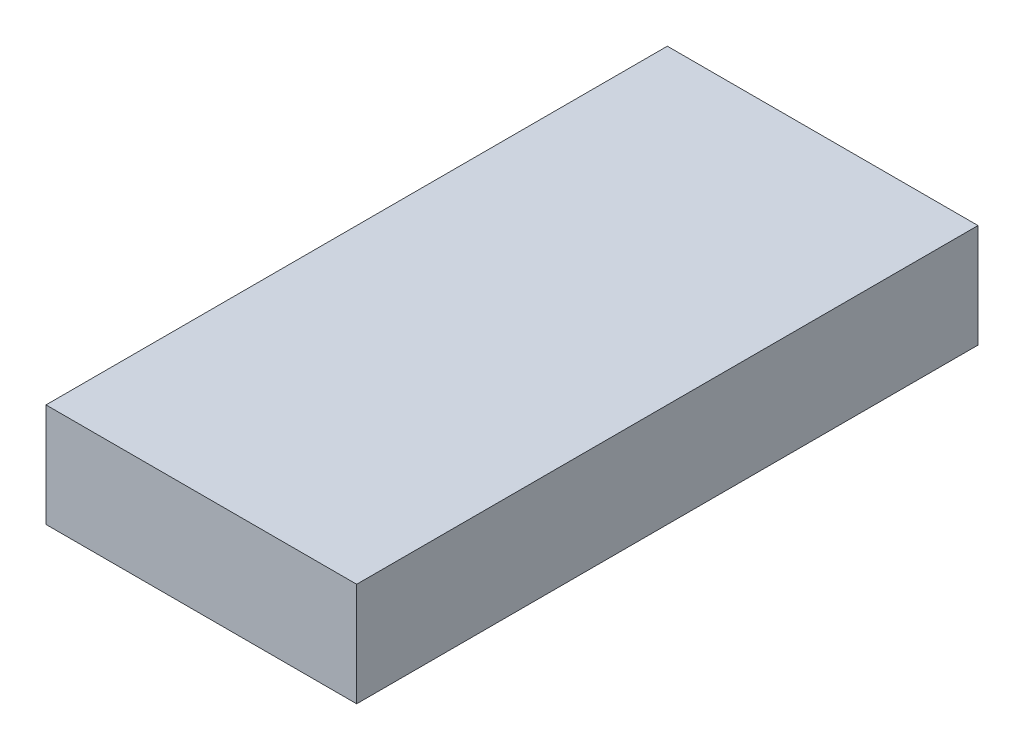
ISO-10303-21;
HEADER;
FILE_DESCRIPTION(('STEP AP214'),'2;1');
FILE_NAME('part.step','',(''),(''),'','','');
FILE_SCHEMA(('AUTOMOTIVE_DESIGN { 1 0 10303 214 1 1 1 1 }'));
ENDSEC;
DATA;
#1=APPLICATION_CONTEXT('core data for automotive mechanical design processes');
#2=APPLICATION_PROTOCOL_DEFINITION('international standard','automotive_design',2000,#1);
#3=PRODUCT_CONTEXT('',#1,'mechanical');
#4=PRODUCT('Part','Part','',(#3));
#5=PRODUCT_RELATED_PRODUCT_CATEGORY('part','',(#4));
#6=PRODUCT_DEFINITION_FORMATION('','',#4);
#7=PRODUCT_DEFINITION_CONTEXT('part definition',#1,'design');
#8=PRODUCT_DEFINITION('design','',#6,#7);
#9=PRODUCT_DEFINITION_SHAPE('','',#8);
#10=(LENGTH_UNIT() NAMED_UNIT(*) SI_UNIT(.MILLI.,.METRE.));
#11=(NAMED_UNIT(*) PLANE_ANGLE_UNIT() SI_UNIT($,.RADIAN.));
#12=(NAMED_UNIT(*) SI_UNIT($,.STERADIAN.) SOLID_ANGLE_UNIT());
#13=UNCERTAINTY_MEASURE_WITH_UNIT(LENGTH_MEASURE(1.E-05),#10,'distance_accuracy_value','');
#14=(GEOMETRIC_REPRESENTATION_CONTEXT(3) GLOBAL_UNCERTAINTY_ASSIGNED_CONTEXT((#13)) GLOBAL_UNIT_ASSIGNED_CONTEXT((#10,
#11,#12)) REPRESENTATION_CONTEXT('',''));
#15=CARTESIAN_POINT('',(0.,0.,0.));
#16=DIRECTION('',(0.,0.,1.));
#17=DIRECTION('',(1.,0.,0.));
#18=AXIS2_PLACEMENT_3D('',#15,#16,#17);
#19=CARTESIAN_POINT('',(15.,10.,30.));
#20=DIRECTION('',(-1.,0.,0.));
#21=DIRECTION('',(0.,0.,1.));
#22=AXIS2_PLACEMENT_3D('',#19,#20,#21);
#23=PLANE('',#22);
#24=DIRECTION('',(0.,0.,-1.));
#25=VECTOR('',#24,1.);
#26=CARTESIAN_POINT('',(15.,0.,30.));
#27=LINE('',#26,#25);
#28=CARTESIAN_POINT('',(15.,0.,30.));
#29=VERTEX_POINT('',#28);
#30=CARTESIAN_POINT('',(15.,0.,-30.));
#31=VERTEX_POINT('',#30);
#32=EDGE_CURVE('E113',#29,#31,#27,.T.);
#33=ORIENTED_EDGE('',*,*,#32,.T.);
#34=DIRECTION('',(0.,-1.,0.));
#35=VECTOR('',#34,1.);
#36=CARTESIAN_POINT('',(15.,10.,-30.));
#37=LINE('',#36,#35);
#38=CARTESIAN_POINT('',(15.,10.,-30.));
#39=VERTEX_POINT('',#38);
#40=EDGE_CURVE('E11',#39,#31,#37,.T.);
#41=ORIENTED_EDGE('',*,*,#40,.F.);
#42=DIRECTION('',(0.,0.,-1.));
#43=VECTOR('',#42,1.);
#44=CARTESIAN_POINT('',(15.,10.,30.));
#45=LINE('',#44,#43);
#46=CARTESIAN_POINT('',(15.,10.,30.));
#47=VERTEX_POINT('',#46);
#48=EDGE_CURVE('E97',#47,#39,#45,.T.);
#49=ORIENTED_EDGE('',*,*,#48,.F.);
#50=DIRECTION('',(0.,-1.,0.));
#51=VECTOR('',#50,1.);
#52=CARTESIAN_POINT('',(15.,10.,30.));
#53=LINE('',#52,#51);
#54=EDGE_CURVE('E109',#47,#29,#53,.T.);
#55=ORIENTED_EDGE('',*,*,#54,.T.);
#56=EDGE_LOOP('',(#33,#41,#49,#55));
#57=FACE_BOUND('',#56,.T.);
#58=ADVANCED_FACE('F45',(#57),#23,.F.);
#59=CARTESIAN_POINT('',(-15.,10.,-30.));
#60=DIRECTION('',(0.,0.,1.));
#61=DIRECTION('',(1.,0.,0.));
#62=AXIS2_PLACEMENT_3D('',#59,#60,#61);
#63=PLANE('',#62);
#64=CARTESIAN_POINT('',(7.49999999999999,5.,-30.));
#65=DIRECTION('',(0.,0.,-1.));
#66=DIRECTION('',(-1.,0.,0.));
#67=AXIS2_PLACEMENT_3D('',#64,#65,#66);
#68=CIRCLE('',#67,2.);
#69=CARTESIAN_POINT('',(5.49999999999999,5.,-30.));
#70=VERTEX_POINT('',#69);
#71=EDGE_CURVE('E142',#70,#70,#68,.T.);
#72=ORIENTED_EDGE('',*,*,#71,.F.);
#73=EDGE_LOOP('',(#72));
#74=FACE_BOUND('',#73,.T.);
#75=CARTESIAN_POINT('',(-7.50000000000004,5.00000000000005,-30.));
#76=DIRECTION('',(0.,0.,-1.));
#77=DIRECTION('',(1.,0.,0.));
#78=AXIS2_PLACEMENT_3D('',#75,#76,#77);
#79=CIRCLE('',#78,2.);
#80=CARTESIAN_POINT('',(-5.50000000000004,5.00000000000005,-30.));
#81=VERTEX_POINT('',#80);
#82=EDGE_CURVE('E138',#81,#81,#79,.T.);
#83=ORIENTED_EDGE('',*,*,#82,.F.);
#84=EDGE_LOOP('',(#83));
#85=FACE_BOUND('',#84,.T.);
#86=DIRECTION('',(-1.,0.,0.));
#87=VECTOR('',#86,1.);
#88=CARTESIAN_POINT('',(-15.,0.,-30.));
#89=LINE('',#88,#87);
#90=CARTESIAN_POINT('',(-15.,0.,-30.));
#91=VERTEX_POINT('',#90);
#92=EDGE_CURVE('E102',#31,#91,#89,.T.);
#93=ORIENTED_EDGE('',*,*,#92,.T.);
#94=DIRECTION('',(0.,-1.,0.));
#95=VECTOR('',#94,1.);
#96=CARTESIAN_POINT('',(-15.,10.,-30.));
#97=LINE('',#96,#95);
#98=CARTESIAN_POINT('',(-15.,10.,-30.));
#99=VERTEX_POINT('',#98);
#100=EDGE_CURVE('E54',#99,#91,#97,.T.);
#101=ORIENTED_EDGE('',*,*,#100,.F.);
#102=DIRECTION('',(-1.,0.,0.));
#103=VECTOR('',#102,1.);
#104=CARTESIAN_POINT('',(-15.,10.,-30.));
#105=LINE('',#104,#103);
#106=EDGE_CURVE('E92',#39,#99,#105,.T.);
#107=ORIENTED_EDGE('',*,*,#106,.F.);
#108=ORIENTED_EDGE('',*,*,#40,.T.);
#109=EDGE_LOOP('',(#93,#101,#107,#108));
#110=FACE_BOUND('',#109,.T.);
#111=ADVANCED_FACE('F101',(#74,#85,#110),#63,.F.);
#112=CARTESIAN_POINT('',(-15.,10.,30.));
#113=DIRECTION('',(1.,0.,0.));
#114=DIRECTION('',(0.,0.,-1.));
#115=AXIS2_PLACEMENT_3D('',#112,#113,#114);
#116=PLANE('',#115);
#117=DIRECTION('',(0.,0.,1.));
#118=VECTOR('',#117,1.);
#119=CARTESIAN_POINT('',(-15.,0.,30.));
#120=LINE('',#119,#118);
#121=CARTESIAN_POINT('',(-15.,0.,30.));
#122=VERTEX_POINT('',#121);
#123=EDGE_CURVE('E79',#91,#122,#120,.T.);
#124=ORIENTED_EDGE('',*,*,#123,.T.);
#125=DIRECTION('',(0.,-1.,0.));
#126=VECTOR('',#125,1.);
#127=CARTESIAN_POINT('',(-15.,10.,30.));
#128=LINE('',#127,#126);
#129=CARTESIAN_POINT('',(-15.,10.,30.));
#130=VERTEX_POINT('',#129);
#131=EDGE_CURVE('E104',#130,#122,#128,.T.);
#132=ORIENTED_EDGE('',*,*,#131,.F.);
#133=DIRECTION('',(0.,0.,1.));
#134=VECTOR('',#133,1.);
#135=CARTESIAN_POINT('',(-15.,10.,30.));
#136=LINE('',#135,#134);
#137=EDGE_CURVE('E95',#99,#130,#136,.T.);
#138=ORIENTED_EDGE('',*,*,#137,.F.);
#139=ORIENTED_EDGE('',*,*,#100,.T.);
#140=EDGE_LOOP('',(#124,#132,#138,#139));
#141=FACE_BOUND('',#140,.T.);
#142=ADVANCED_FACE('F105',(#141),#116,.F.);
#143=CARTESIAN_POINT('',(-15.,10.,30.));
#144=DIRECTION('',(0.,0.,-1.));
#145=DIRECTION('',(-1.,0.,0.));
#146=AXIS2_PLACEMENT_3D('',#143,#144,#145);
#147=PLANE('',#146);
#148=DIRECTION('',(1.,0.,0.));
#149=VECTOR('',#148,1.);
#150=CARTESIAN_POINT('',(-15.,0.,30.));
#151=LINE('',#150,#149);
#152=EDGE_CURVE('E85',#122,#29,#151,.T.);
#153=ORIENTED_EDGE('',*,*,#152,.T.);
#154=ORIENTED_EDGE('',*,*,#54,.F.);
#155=DIRECTION('',(1.,0.,0.));
#156=VECTOR('',#155,1.);
#157=CARTESIAN_POINT('',(-15.,10.,30.));
#158=LINE('',#157,#156);
#159=EDGE_CURVE('E62',#130,#47,#158,.T.);
#160=ORIENTED_EDGE('',*,*,#159,.F.);
#161=ORIENTED_EDGE('',*,*,#131,.T.);
#162=EDGE_LOOP('',(#153,#154,#160,#161));
#163=FACE_BOUND('',#162,.T.);
#164=ADVANCED_FACE('F127',(#163),#147,.F.);
#165=CARTESIAN_POINT('',(0.,10.,0.));
#166=DIRECTION('',(0.,-1.,0.));
#167=DIRECTION('',(0.,0.,-1.));
#168=AXIS2_PLACEMENT_3D('',#165,#166,#167);
#169=PLANE('',#168);
#170=ORIENTED_EDGE('',*,*,#48,.T.);
#171=ORIENTED_EDGE('',*,*,#106,.T.);
#172=ORIENTED_EDGE('',*,*,#137,.T.);
#173=ORIENTED_EDGE('',*,*,#159,.T.);
#174=EDGE_LOOP('',(#170,#171,#172,#173));
#175=FACE_BOUND('',#174,.T.);
#176=ADVANCED_FACE('F93',(#175),#169,.F.);
#177=CARTESIAN_POINT('',(0.,0.,0.));
#178=DIRECTION('',(0.,-1.,0.));
#179=DIRECTION('',(0.,0.,-1.));
#180=AXIS2_PLACEMENT_3D('',#177,#178,#179);
#181=PLANE('',#180);
#182=ORIENTED_EDGE('',*,*,#32,.F.);
#183=ORIENTED_EDGE('',*,*,#152,.F.);
#184=ORIENTED_EDGE('',*,*,#123,.F.);
#185=ORIENTED_EDGE('',*,*,#92,.F.);
#186=EDGE_LOOP('',(#182,#183,#184,#185));
#187=FACE_BOUND('',#186,.T.);
#188=ADVANCED_FACE('F130',(#187),#181,.T.);
#189=CARTESIAN_POINT('',(-7.50000000000004,5.00000000000005,10.));
#190=DIRECTION('',(0.,0.,-1.));
#191=DIRECTION('',(-1.,0.,0.));
#192=AXIS2_PLACEMENT_3D('',#189,#190,#191);
#193=CYLINDRICAL_SURFACE('',#192,2.);
#194=CARTESIAN_POINT('',(-7.50000000000004,5.00000000000005,10.));
#195=DIRECTION('',(0.,0.,-1.));
#196=DIRECTION('',(1.,0.,0.));
#197=AXIS2_PLACEMENT_3D('',#194,#195,#196);
#198=CIRCLE('',#197,2.);
#199=CARTESIAN_POINT('',(-5.50000000000004,5.00000000000005,10.));
#200=VERTEX_POINT('',#199);
#201=EDGE_CURVE('E134',#200,#200,#198,.T.);
#202=ORIENTED_EDGE('',*,*,#201,.F.);
#203=EDGE_LOOP('',(#202));
#204=FACE_BOUND('',#203,.T.);
#205=ORIENTED_EDGE('',*,*,#82,.T.);
#206=EDGE_LOOP('',(#205));
#207=FACE_BOUND('',#206,.T.);
#208=ADVANCED_FACE('F163',(#204,#207),#193,.F.);
#209=CARTESIAN_POINT('',(-7.50000000000004,5.00000000000005,10.));
#210=DIRECTION('',(0.,0.,1.));
#211=DIRECTION('',(1.,0.,0.));
#212=AXIS2_PLACEMENT_3D('',#209,#210,#211);
#213=PLANE('',#212);
#214=ORIENTED_EDGE('',*,*,#201,.T.);
#215=EDGE_LOOP('',(#214));
#216=FACE_BOUND('',#215,.T.);
#217=ADVANCED_FACE('F155',(#216),#213,.F.);
#218=CARTESIAN_POINT('',(7.49999999999999,5.,10.));
#219=DIRECTION('',(0.,0.,-1.));
#220=DIRECTION('',(-1.,0.,0.));
#221=AXIS2_PLACEMENT_3D('',#218,#219,#220);
#222=CYLINDRICAL_SURFACE('',#221,2.);
#223=CARTESIAN_POINT('',(7.49999999999999,5.,10.));
#224=DIRECTION('',(0.,0.,-1.));
#225=DIRECTION('',(-1.,0.,0.));
#226=AXIS2_PLACEMENT_3D('',#223,#224,#225);
#227=CIRCLE('',#226,2.);
#228=CARTESIAN_POINT('',(5.49999999999999,5.,10.));
#229=VERTEX_POINT('',#228);
#230=EDGE_CURVE('E117',#229,#229,#227,.T.);
#231=ORIENTED_EDGE('',*,*,#230,.F.);
#232=EDGE_LOOP('',(#231));
#233=FACE_BOUND('',#232,.T.);
#234=ORIENTED_EDGE('',*,*,#71,.T.);
#235=EDGE_LOOP('',(#234));
#236=FACE_BOUND('',#235,.T.);
#237=ADVANCED_FACE('F152',(#233,#236),#222,.F.);
#238=CARTESIAN_POINT('',(7.49999999999999,5.,10.));
#239=DIRECTION('',(0.,0.,-1.));
#240=DIRECTION('',(-1.,0.,0.));
#241=AXIS2_PLACEMENT_3D('',#238,#239,#240);
#242=PLANE('',#241);
#243=ORIENTED_EDGE('',*,*,#230,.T.);
#244=EDGE_LOOP('',(#243));
#245=FACE_BOUND('',#244,.T.);
#246=ADVANCED_FACE('F150',(#245),#242,.T.);
#247=CLOSED_SHELL('',(#58,#111,#142,#164,#176,#188,#208,#217,#237,#246));
#248=MANIFOLD_SOLID_BREP('B2',#247);
#249=ADVANCED_BREP_SHAPE_REPRESENTATION('',(#18,#248),#14);
#250=SHAPE_DEFINITION_REPRESENTATION(#9,#249);
ENDSEC;
END-ISO-10303-21;
